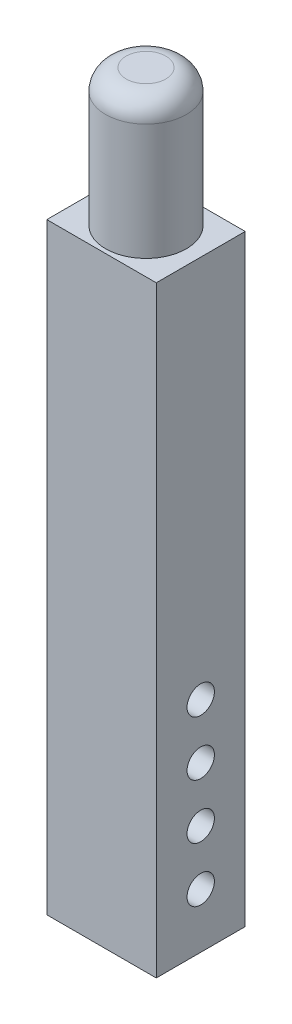
ISO-10303-21;
HEADER;
FILE_DESCRIPTION(('STEP AP214'),'2;1');
FILE_NAME('part.step','',(''),(''),'','','');
FILE_SCHEMA(('AUTOMOTIVE_DESIGN { 1 0 10303 214 1 1 1 1 }'));
ENDSEC;
DATA;
#1=APPLICATION_CONTEXT('core data for automotive mechanical design processes');
#2=APPLICATION_PROTOCOL_DEFINITION('international standard','automotive_design',2000,#1);
#3=PRODUCT_CONTEXT('',#1,'mechanical');
#4=PRODUCT('Part','Part','',(#3));
#5=PRODUCT_RELATED_PRODUCT_CATEGORY('part','',(#4));
#6=PRODUCT_DEFINITION_FORMATION('','',#4);
#7=PRODUCT_DEFINITION_CONTEXT('part definition',#1,'design');
#8=PRODUCT_DEFINITION('design','',#6,#7);
#9=PRODUCT_DEFINITION_SHAPE('','',#8);
#10=(LENGTH_UNIT() NAMED_UNIT(*) SI_UNIT(.MILLI.,.METRE.));
#11=(NAMED_UNIT(*) PLANE_ANGLE_UNIT() SI_UNIT($,.RADIAN.));
#12=(NAMED_UNIT(*) SI_UNIT($,.STERADIAN.) SOLID_ANGLE_UNIT());
#13=UNCERTAINTY_MEASURE_WITH_UNIT(LENGTH_MEASURE(1.E-05),#10,'distance_accuracy_value','');
#14=(GEOMETRIC_REPRESENTATION_CONTEXT(3) GLOBAL_UNCERTAINTY_ASSIGNED_CONTEXT((#13)) GLOBAL_UNIT_ASSIGNED_CONTEXT((#10,
#11,#12)) REPRESENTATION_CONTEXT('',''));
#15=CARTESIAN_POINT('',(0.,0.,0.));
#16=DIRECTION('',(0.,0.,1.));
#17=DIRECTION('',(1.,0.,0.));
#18=AXIS2_PLACEMENT_3D('',#15,#16,#17);
#19=CARTESIAN_POINT('',(-5.08,55.88,4.1275));
#20=DIRECTION('',(0.,1.,0.));
#21=DIRECTION('',(0.,0.,1.));
#22=AXIS2_PLACEMENT_3D('',#19,#20,#21);
#23=PLANE('',#22);
#24=DIRECTION('',(0.,0.,1.));
#25=VECTOR('',#24,1.);
#26=CARTESIAN_POINT('',(-5.08,55.88,-4.1275));
#27=LINE('',#26,#25);
#28=CARTESIAN_POINT('',(-5.08,55.88,-4.1275));
#29=VERTEX_POINT('',#28);
#30=CARTESIAN_POINT('',(-5.08,55.88,4.1275));
#31=VERTEX_POINT('',#30);
#32=EDGE_CURVE('E86',#29,#31,#27,.T.);
#33=ORIENTED_EDGE('',*,*,#32,.T.);
#34=DIRECTION('',(1.,0.,0.));
#35=VECTOR('',#34,1.);
#36=CARTESIAN_POINT('',(-5.08,55.88,4.1275));
#37=LINE('',#36,#35);
#38=CARTESIAN_POINT('',(5.08,55.88,4.1275));
#39=VERTEX_POINT('',#38);
#40=EDGE_CURVE('E81',#31,#39,#37,.T.);
#41=ORIENTED_EDGE('',*,*,#40,.T.);
#42=DIRECTION('',(0.,0.,-1.));
#43=VECTOR('',#42,1.);
#44=CARTESIAN_POINT('',(5.08,55.88,-4.1275));
#45=LINE('',#44,#43);
#46=CARTESIAN_POINT('',(5.08,55.88,-4.1275));
#47=VERTEX_POINT('',#46);
#48=EDGE_CURVE('E84',#39,#47,#45,.T.);
#49=ORIENTED_EDGE('',*,*,#48,.T.);
#50=DIRECTION('',(-1.,0.,0.));
#51=VECTOR('',#50,1.);
#52=CARTESIAN_POINT('',(-5.08,55.88,-4.1275));
#53=LINE('',#52,#51);
#54=EDGE_CURVE('E50',#47,#29,#53,.T.);
#55=ORIENTED_EDGE('',*,*,#54,.T.);
#56=EDGE_LOOP('',(#33,#41,#49,#55));
#57=FACE_BOUND('',#56,.T.);
#58=CARTESIAN_POINT('',(0.,55.88,0.));
#59=DIRECTION('',(0.,1.,0.));
#60=DIRECTION('',(0.,0.,1.));
#61=AXIS2_PLACEMENT_3D('',#58,#59,#60);
#62=CIRCLE('',#61,3.7465);
#63=CARTESIAN_POINT('',(0.,55.88,3.7465));
#64=VERTEX_POINT('',#63);
#65=EDGE_CURVE('E105',#64,#64,#62,.T.);
#66=ORIENTED_EDGE('',*,*,#65,.F.);
#67=EDGE_LOOP('',(#66));
#68=FACE_BOUND('',#67,.T.);
#69=ADVANCED_FACE('F33',(#57,#68),#23,.T.);
#70=CARTESIAN_POINT('',(-5.08,55.88,-4.1275));
#71=DIRECTION('',(1.,0.,0.));
#72=DIRECTION('',(0.,0.,-1.));
#73=AXIS2_PLACEMENT_3D('',#70,#71,#72);
#74=PLANE('',#73);
#75=CARTESIAN_POINT('',(-5.08,10.16,0.));
#76=DIRECTION('',(1.,0.,0.));
#77=DIRECTION('',(0.,0.,-1.));
#78=AXIS2_PLACEMENT_3D('',#75,#76,#77);
#79=CIRCLE('',#78,1.27);
#80=CARTESIAN_POINT('',(-5.08,10.16,-1.27));
#81=VERTEX_POINT('',#80);
#82=EDGE_CURVE('E207',#81,#81,#79,.T.);
#83=ORIENTED_EDGE('',*,*,#82,.T.);
#84=EDGE_LOOP('',(#83));
#85=FACE_BOUND('',#84,.T.);
#86=CARTESIAN_POINT('',(-5.08,5.08,0.));
#87=DIRECTION('',(1.,0.,0.));
#88=DIRECTION('',(0.,0.,-1.));
#89=AXIS2_PLACEMENT_3D('',#86,#87,#88);
#90=CIRCLE('',#89,1.27);
#91=CARTESIAN_POINT('',(-5.08,5.08,-1.27));
#92=VERTEX_POINT('',#91);
#93=EDGE_CURVE('E196',#92,#92,#90,.T.);
#94=ORIENTED_EDGE('',*,*,#93,.T.);
#95=EDGE_LOOP('',(#94));
#96=FACE_BOUND('',#95,.T.);
#97=DIRECTION('',(0.,0.,1.));
#98=VECTOR('',#97,1.);
#99=CARTESIAN_POINT('',(-5.08,0.,-4.1275));
#100=LINE('',#99,#98);
#101=CARTESIAN_POINT('',(-5.08,0.,-4.1275));
#102=VERTEX_POINT('',#101);
#103=CARTESIAN_POINT('',(-5.08,0.,4.1275));
#104=VERTEX_POINT('',#103);
#105=EDGE_CURVE('E102',#102,#104,#100,.T.);
#106=ORIENTED_EDGE('',*,*,#105,.T.);
#107=DIRECTION('',(0.,-1.,0.));
#108=VECTOR('',#107,1.);
#109=CARTESIAN_POINT('',(-5.08,55.88,4.1275));
#110=LINE('',#109,#108);
#111=EDGE_CURVE('E92',#31,#104,#110,.T.);
#112=ORIENTED_EDGE('',*,*,#111,.F.);
#113=ORIENTED_EDGE('',*,*,#32,.F.);
#114=DIRECTION('',(0.,-1.,0.));
#115=VECTOR('',#114,1.);
#116=CARTESIAN_POINT('',(-5.08,55.88,-4.1275));
#117=LINE('',#116,#115);
#118=EDGE_CURVE('E98',#29,#102,#117,.T.);
#119=ORIENTED_EDGE('',*,*,#118,.T.);
#120=EDGE_LOOP('',(#106,#112,#113,#119));
#121=FACE_BOUND('',#120,.T.);
#122=CARTESIAN_POINT('',(-5.08,15.24,0.));
#123=DIRECTION('',(1.,0.,0.));
#124=DIRECTION('',(0.,0.,-1.));
#125=AXIS2_PLACEMENT_3D('',#122,#123,#124);
#126=CIRCLE('',#125,1.27);
#127=CARTESIAN_POINT('',(-5.08,15.24,-1.27));
#128=VERTEX_POINT('',#127);
#129=EDGE_CURVE('E112',#128,#128,#126,.T.);
#130=ORIENTED_EDGE('',*,*,#129,.T.);
#131=EDGE_LOOP('',(#130));
#132=FACE_BOUND('',#131,.T.);
#133=CARTESIAN_POINT('',(-5.08,20.32,0.));
#134=DIRECTION('',(1.,0.,0.));
#135=DIRECTION('',(0.,0.,-1.));
#136=AXIS2_PLACEMENT_3D('',#133,#134,#135);
#137=CIRCLE('',#136,1.27);
#138=CARTESIAN_POINT('',(-5.08,20.32,-1.27));
#139=VERTEX_POINT('',#138);
#140=EDGE_CURVE('E118',#139,#139,#137,.T.);
#141=ORIENTED_EDGE('',*,*,#140,.T.);
#142=EDGE_LOOP('',(#141));
#143=FACE_BOUND('',#142,.T.);
#144=ADVANCED_FACE('F138',(#85,#96,#121,#132,#143),#74,.F.);
#145=CARTESIAN_POINT('',(-5.08,55.88,4.1275));
#146=DIRECTION('',(0.,0.,-1.));
#147=DIRECTION('',(-1.,0.,0.));
#148=AXIS2_PLACEMENT_3D('',#145,#146,#147);
#149=PLANE('',#148);
#150=DIRECTION('',(1.,0.,0.));
#151=VECTOR('',#150,1.);
#152=CARTESIAN_POINT('',(-5.08,0.,4.1275));
#153=LINE('',#152,#151);
#154=CARTESIAN_POINT('',(5.08,0.,4.1275));
#155=VERTEX_POINT('',#154);
#156=EDGE_CURVE('E91',#104,#155,#153,.T.);
#157=ORIENTED_EDGE('',*,*,#156,.T.);
#158=DIRECTION('',(0.,-1.,0.));
#159=VECTOR('',#158,1.);
#160=CARTESIAN_POINT('',(5.08,55.88,4.1275));
#161=LINE('',#160,#159);
#162=EDGE_CURVE('E89',#39,#155,#161,.T.);
#163=ORIENTED_EDGE('',*,*,#162,.F.);
#164=ORIENTED_EDGE('',*,*,#40,.F.);
#165=ORIENTED_EDGE('',*,*,#111,.T.);
#166=EDGE_LOOP('',(#157,#163,#164,#165));
#167=FACE_BOUND('',#166,.T.);
#168=ADVANCED_FACE('F90',(#167),#149,.F.);
#169=CARTESIAN_POINT('',(5.08,55.88,-4.1275));
#170=DIRECTION('',(-1.,0.,0.));
#171=DIRECTION('',(0.,0.,1.));
#172=AXIS2_PLACEMENT_3D('',#169,#170,#171);
#173=PLANE('',#172);
#174=CARTESIAN_POINT('',(5.08,10.16,0.));
#175=DIRECTION('',(1.,0.,0.));
#176=DIRECTION('',(0.,0.,-1.));
#177=AXIS2_PLACEMENT_3D('',#174,#175,#176);
#178=CIRCLE('',#177,1.27);
#179=CARTESIAN_POINT('',(5.08,10.16,-1.27));
#180=VERTEX_POINT('',#179);
#181=EDGE_CURVE('E203',#180,#180,#178,.T.);
#182=ORIENTED_EDGE('',*,*,#181,.F.);
#183=EDGE_LOOP('',(#182));
#184=FACE_BOUND('',#183,.T.);
#185=CARTESIAN_POINT('',(5.08,5.08,0.));
#186=DIRECTION('',(1.,0.,0.));
#187=DIRECTION('',(0.,0.,-1.));
#188=AXIS2_PLACEMENT_3D('',#185,#186,#187);
#189=CIRCLE('',#188,1.27);
#190=CARTESIAN_POINT('',(5.08,5.08,-1.27));
#191=VERTEX_POINT('',#190);
#192=EDGE_CURVE('E199',#191,#191,#189,.T.);
#193=ORIENTED_EDGE('',*,*,#192,.F.);
#194=EDGE_LOOP('',(#193));
#195=FACE_BOUND('',#194,.T.);
#196=DIRECTION('',(0.,0.,-1.));
#197=VECTOR('',#196,1.);
#198=CARTESIAN_POINT('',(5.08,0.,-4.1275));
#199=LINE('',#198,#197);
#200=CARTESIAN_POINT('',(5.08,0.,-4.1275));
#201=VERTEX_POINT('',#200);
#202=EDGE_CURVE('E67',#155,#201,#199,.T.);
#203=ORIENTED_EDGE('',*,*,#202,.T.);
#204=DIRECTION('',(0.,-1.,0.));
#205=VECTOR('',#204,1.);
#206=CARTESIAN_POINT('',(5.08,55.88,-4.1275));
#207=LINE('',#206,#205);
#208=EDGE_CURVE('E93',#47,#201,#207,.T.);
#209=ORIENTED_EDGE('',*,*,#208,.F.);
#210=ORIENTED_EDGE('',*,*,#48,.F.);
#211=ORIENTED_EDGE('',*,*,#162,.T.);
#212=EDGE_LOOP('',(#203,#209,#210,#211));
#213=FACE_BOUND('',#212,.T.);
#214=CARTESIAN_POINT('',(5.08,15.24,0.));
#215=DIRECTION('',(1.,0.,0.));
#216=DIRECTION('',(0.,0.,-1.));
#217=AXIS2_PLACEMENT_3D('',#214,#215,#216);
#218=CIRCLE('',#217,1.27);
#219=CARTESIAN_POINT('',(5.08,15.24,-1.27));
#220=VERTEX_POINT('',#219);
#221=EDGE_CURVE('E115',#220,#220,#218,.T.);
#222=ORIENTED_EDGE('',*,*,#221,.F.);
#223=EDGE_LOOP('',(#222));
#224=FACE_BOUND('',#223,.T.);
#225=CARTESIAN_POINT('',(5.08,20.32,0.));
#226=DIRECTION('',(1.,0.,0.));
#227=DIRECTION('',(0.,0.,-1.));
#228=AXIS2_PLACEMENT_3D('',#225,#226,#227);
#229=CIRCLE('',#228,1.27);
#230=CARTESIAN_POINT('',(5.08,20.32,-1.27));
#231=VERTEX_POINT('',#230);
#232=EDGE_CURVE('E121',#231,#231,#229,.T.);
#233=ORIENTED_EDGE('',*,*,#232,.F.);
#234=EDGE_LOOP('',(#233));
#235=FACE_BOUND('',#234,.T.);
#236=ADVANCED_FACE('F95',(#184,#195,#213,#224,#235),#173,.F.);
#237=CARTESIAN_POINT('',(-5.08,55.88,-4.1275));
#238=DIRECTION('',(0.,0.,1.));
#239=DIRECTION('',(1.,0.,0.));
#240=AXIS2_PLACEMENT_3D('',#237,#238,#239);
#241=PLANE('',#240);
#242=DIRECTION('',(-1.,0.,0.));
#243=VECTOR('',#242,1.);
#244=CARTESIAN_POINT('',(-5.08,0.,-4.1275));
#245=LINE('',#244,#243);
#246=EDGE_CURVE('E73',#201,#102,#245,.T.);
#247=ORIENTED_EDGE('',*,*,#246,.T.);
#248=ORIENTED_EDGE('',*,*,#118,.F.);
#249=ORIENTED_EDGE('',*,*,#54,.F.);
#250=ORIENTED_EDGE('',*,*,#208,.T.);
#251=EDGE_LOOP('',(#247,#248,#249,#250));
#252=FACE_BOUND('',#251,.T.);
#253=ADVANCED_FACE('F152',(#252),#241,.F.);
#254=CARTESIAN_POINT('',(-5.08,0.,4.1275));
#255=DIRECTION('',(0.,1.,0.));
#256=DIRECTION('',(0.,0.,1.));
#257=AXIS2_PLACEMENT_3D('',#254,#255,#256);
#258=PLANE('',#257);
#259=ORIENTED_EDGE('',*,*,#105,.F.);
#260=ORIENTED_EDGE('',*,*,#246,.F.);
#261=ORIENTED_EDGE('',*,*,#202,.F.);
#262=ORIENTED_EDGE('',*,*,#156,.F.);
#263=EDGE_LOOP('',(#259,#260,#261,#262));
#264=FACE_BOUND('',#263,.T.);
#265=ADVANCED_FACE('F149',(#264),#258,.F.);
#266=CARTESIAN_POINT('',(0.,68.58,0.));
#267=DIRECTION('',(0.,-1.,0.));
#268=DIRECTION('',(0.,0.,-1.));
#269=AXIS2_PLACEMENT_3D('',#266,#267,#268);
#270=CYLINDRICAL_SURFACE('',#269,3.7465);
#271=CARTESIAN_POINT('',(0.,66.675,0.));
#272=DIRECTION('',(0.,1.,0.));
#273=DIRECTION('',(0.,0.,1.));
#274=AXIS2_PLACEMENT_3D('',#271,#272,#273);
#275=CIRCLE('',#274,3.7465);
#276=CARTESIAN_POINT('',(0.,66.675,3.7465));
#277=VERTEX_POINT('',#276);
#278=EDGE_CURVE('E11',#277,#277,#275,.F.);
#279=ORIENTED_EDGE('',*,*,#278,.T.);
#280=EDGE_LOOP('',(#279));
#281=FACE_BOUND('',#280,.T.);
#282=ORIENTED_EDGE('',*,*,#65,.T.);
#283=EDGE_LOOP('',(#282));
#284=FACE_BOUND('',#283,.T.);
#285=ADVANCED_FACE('F147',(#281,#284),#270,.T.);
#286=CARTESIAN_POINT('',(0.,68.58,0.));
#287=DIRECTION('',(0.,1.,0.));
#288=DIRECTION('',(0.,0.,1.));
#289=AXIS2_PLACEMENT_3D('',#286,#287,#288);
#290=PLANE('',#289);
#291=CARTESIAN_POINT('',(0.,68.58,0.));
#292=DIRECTION('',(0.,1.,0.));
#293=DIRECTION('',(0.,0.,1.));
#294=AXIS2_PLACEMENT_3D('',#291,#292,#293);
#295=CIRCLE('',#294,1.8415);
#296=CARTESIAN_POINT('',(0.,68.58,1.8415));
#297=VERTEX_POINT('',#296);
#298=EDGE_CURVE('E42',#297,#297,#295,.T.);
#299=ORIENTED_EDGE('',*,*,#298,.T.);
#300=EDGE_LOOP('',(#299));
#301=FACE_BOUND('',#300,.T.);
#302=ADVANCED_FACE('F126',(#301),#290,.T.);
#303=CARTESIAN_POINT('',(-5.08,5.08,0.));
#304=DIRECTION('',(1.,0.,0.));
#305=DIRECTION('',(0.,0.,-1.));
#306=AXIS2_PLACEMENT_3D('',#303,#304,#305);
#307=CYLINDRICAL_SURFACE('',#306,1.27);
#308=ORIENTED_EDGE('',*,*,#93,.F.);
#309=EDGE_LOOP('',(#308));
#310=FACE_BOUND('',#309,.T.);
#311=ORIENTED_EDGE('',*,*,#192,.T.);
#312=EDGE_LOOP('',(#311));
#313=FACE_BOUND('',#312,.T.);
#314=ADVANCED_FACE('F167',(#310,#313),#307,.F.);
#315=CARTESIAN_POINT('',(-5.08,10.16,0.));
#316=DIRECTION('',(1.,0.,0.));
#317=DIRECTION('',(0.,0.,-1.));
#318=AXIS2_PLACEMENT_3D('',#315,#316,#317);
#319=CYLINDRICAL_SURFACE('',#318,1.27);
#320=ORIENTED_EDGE('',*,*,#82,.F.);
#321=EDGE_LOOP('',(#320));
#322=FACE_BOUND('',#321,.T.);
#323=ORIENTED_EDGE('',*,*,#181,.T.);
#324=EDGE_LOOP('',(#323));
#325=FACE_BOUND('',#324,.T.);
#326=ADVANCED_FACE('F162',(#322,#325),#319,.F.);
#327=CARTESIAN_POINT('',(-5.08,15.24,0.));
#328=DIRECTION('',(1.,0.,0.));
#329=DIRECTION('',(0.,0.,-1.));
#330=AXIS2_PLACEMENT_3D('',#327,#328,#329);
#331=CYLINDRICAL_SURFACE('',#330,1.27);
#332=ORIENTED_EDGE('',*,*,#129,.F.);
#333=EDGE_LOOP('',(#332));
#334=FACE_BOUND('',#333,.T.);
#335=ORIENTED_EDGE('',*,*,#221,.T.);
#336=EDGE_LOOP('',(#335));
#337=FACE_BOUND('',#336,.T.);
#338=ADVANCED_FACE('F134',(#334,#337),#331,.F.);
#339=CARTESIAN_POINT('',(-5.08,20.32,0.));
#340=DIRECTION('',(1.,0.,0.));
#341=DIRECTION('',(0.,0.,-1.));
#342=AXIS2_PLACEMENT_3D('',#339,#340,#341);
#343=CYLINDRICAL_SURFACE('',#342,1.27);
#344=ORIENTED_EDGE('',*,*,#140,.F.);
#345=EDGE_LOOP('',(#344));
#346=FACE_BOUND('',#345,.T.);
#347=ORIENTED_EDGE('',*,*,#232,.T.);
#348=EDGE_LOOP('',(#347));
#349=FACE_BOUND('',#348,.T.);
#350=ADVANCED_FACE('F129',(#346,#349),#343,.F.);
#351=CARTESIAN_POINT('',(0.,66.675,0.));
#352=DIRECTION('',(0.,1.,0.));
#353=DIRECTION('',(0.,0.,1.));
#354=AXIS2_PLACEMENT_3D('',#351,#352,#353);
#355=DEGENERATE_TOROIDAL_SURFACE('',#354,1.8415,1.905,.T.);
#356=ORIENTED_EDGE('',*,*,#278,.F.);
#357=EDGE_LOOP('',(#356));
#358=FACE_BOUND('',#357,.T.);
#359=ORIENTED_EDGE('',*,*,#298,.F.);
#360=EDGE_LOOP('',(#359));
#361=FACE_BOUND('',#360,.T.);
#362=ADVANCED_FACE('F35',(#358,#361),#355,.T.);
#363=CLOSED_SHELL('',(#69,#144,#168,#236,#253,#265,#285,#302,#314,#326,#338,#350,#362));
#364=MANIFOLD_SOLID_BREP('B2',#363);
#365=ADVANCED_BREP_SHAPE_REPRESENTATION('',(#18,#364),#14);
#366=SHAPE_DEFINITION_REPRESENTATION(#9,#365);
ENDSEC;
END-ISO-10303-21;
